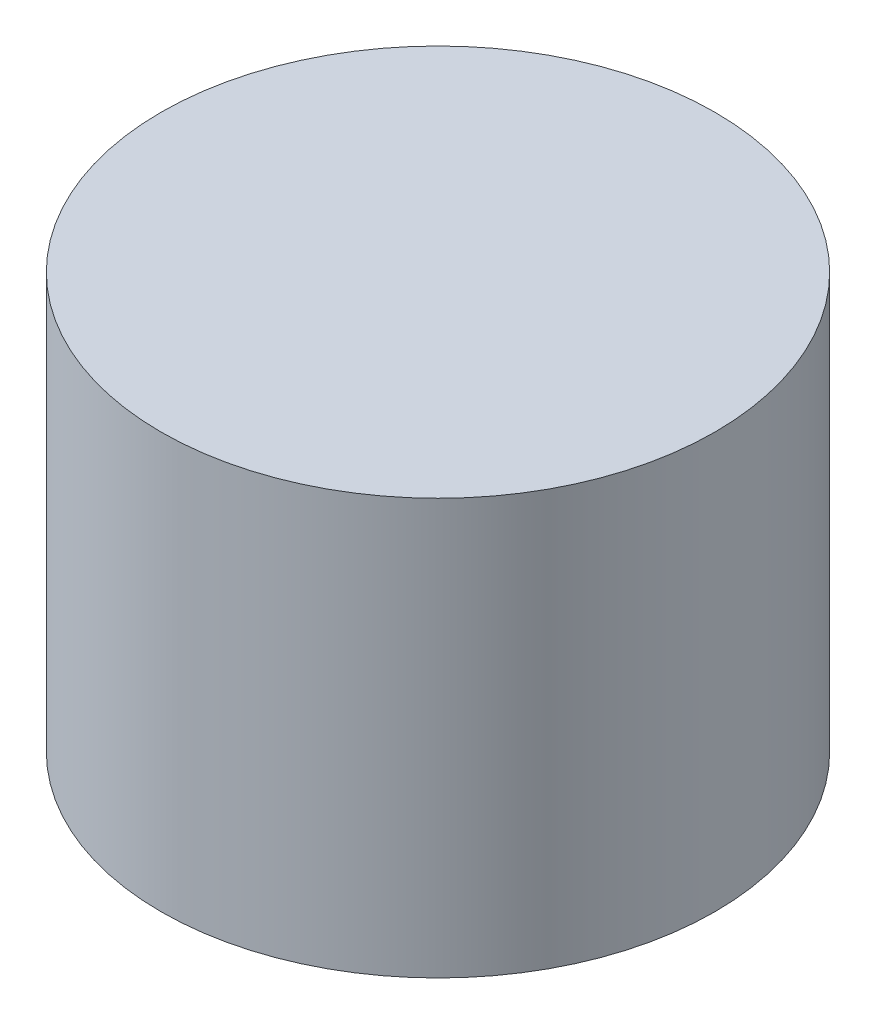
ISO-10303-21;
HEADER;
FILE_DESCRIPTION(('STEP AP214'),'2;1');
FILE_NAME('part.step','',(''),(''),'','','');
FILE_SCHEMA(('AUTOMOTIVE_DESIGN { 1 0 10303 214 1 1 1 1 }'));
ENDSEC;
DATA;
#1=APPLICATION_CONTEXT('core data for automotive mechanical design processes');
#2=APPLICATION_PROTOCOL_DEFINITION('international standard','automotive_design',2000,#1);
#3=PRODUCT_CONTEXT('',#1,'mechanical');
#4=PRODUCT('Part','Part','',(#3));
#5=PRODUCT_RELATED_PRODUCT_CATEGORY('part','',(#4));
#6=PRODUCT_DEFINITION_FORMATION('','',#4);
#7=PRODUCT_DEFINITION_CONTEXT('part definition',#1,'design');
#8=PRODUCT_DEFINITION('design','',#6,#7);
#9=PRODUCT_DEFINITION_SHAPE('','',#8);
#10=(LENGTH_UNIT() NAMED_UNIT(*) SI_UNIT(.MILLI.,.METRE.));
#11=(NAMED_UNIT(*) PLANE_ANGLE_UNIT() SI_UNIT($,.RADIAN.));
#12=(NAMED_UNIT(*) SI_UNIT($,.STERADIAN.) SOLID_ANGLE_UNIT());
#13=UNCERTAINTY_MEASURE_WITH_UNIT(LENGTH_MEASURE(1.E-05),#10,'distance_accuracy_value','');
#14=(GEOMETRIC_REPRESENTATION_CONTEXT(3) GLOBAL_UNCERTAINTY_ASSIGNED_CONTEXT((#13)) GLOBAL_UNIT_ASSIGNED_CONTEXT((#10,
#11,#12)) REPRESENTATION_CONTEXT('',''));
#15=CARTESIAN_POINT('',(0.,0.,0.));
#16=DIRECTION('',(0.,0.,1.));
#17=DIRECTION('',(1.,0.,0.));
#18=AXIS2_PLACEMENT_3D('',#15,#16,#17);
#19=CARTESIAN_POINT('',(0.,15.,0.));
#20=DIRECTION('',(0.,-1.,0.));
#21=DIRECTION('',(0.,0.,-1.));
#22=AXIS2_PLACEMENT_3D('',#19,#20,#21);
#23=CYLINDRICAL_SURFACE('',#22,10.);
#24=CARTESIAN_POINT('',(0.,15.,0.));
#25=DIRECTION('',(0.,1.,0.));
#26=DIRECTION('',(0.,0.,1.));
#27=AXIS2_PLACEMENT_3D('',#24,#25,#26);
#28=CIRCLE('',#27,10.);
#29=CARTESIAN_POINT('',(0.,15.,10.));
#30=VERTEX_POINT('',#29);
#31=EDGE_CURVE('E10',#30,#30,#28,.T.);
#32=ORIENTED_EDGE('',*,*,#31,.F.);
#33=EDGE_LOOP('',(#32));
#34=FACE_BOUND('',#33,.T.);
#35=CARTESIAN_POINT('',(0.,0.,0.));
#36=DIRECTION('',(0.,1.,0.));
#37=DIRECTION('',(0.,0.,1.));
#38=AXIS2_PLACEMENT_3D('',#35,#36,#37);
#39=CIRCLE('',#38,10.);
#40=CARTESIAN_POINT('',(0.,0.,10.));
#41=VERTEX_POINT('',#40);
#42=EDGE_CURVE('E49',#41,#41,#39,.T.);
#43=ORIENTED_EDGE('',*,*,#42,.T.);
#44=EDGE_LOOP('',(#43));
#45=FACE_BOUND('',#44,.T.);
#46=ADVANCED_FACE('F50',(#34,#45),#23,.T.);
#47=CARTESIAN_POINT('',(0.,15.,0.));
#48=DIRECTION('',(0.,1.,0.));
#49=DIRECTION('',(0.,0.,1.));
#50=AXIS2_PLACEMENT_3D('',#47,#48,#49);
#51=PLANE('',#50);
#52=ORIENTED_EDGE('',*,*,#31,.T.);
#53=EDGE_LOOP('',(#52));
#54=FACE_BOUND('',#53,.T.);
#55=ADVANCED_FACE('F63',(#54),#51,.T.);
#56=CARTESIAN_POINT('',(0.,0.,0.));
#57=DIRECTION('',(0.,1.,0.));
#58=DIRECTION('',(0.,0.,1.));
#59=AXIS2_PLACEMENT_3D('',#56,#57,#58);
#60=PLANE('',#59);
#61=ORIENTED_EDGE('',*,*,#42,.F.);
#62=EDGE_LOOP('',(#61));
#63=FACE_BOUND('',#62,.T.);
#64=ADVANCED_FACE('F62',(#63),#60,.F.);
#65=CLOSED_SHELL('',(#46,#55,#64));
#66=MANIFOLD_SOLID_BREP('B2',#65);
#67=ADVANCED_BREP_SHAPE_REPRESENTATION('',(#18,#66),#14);
#68=SHAPE_DEFINITION_REPRESENTATION(#9,#67);
ENDSEC;
END-ISO-10303-21;
